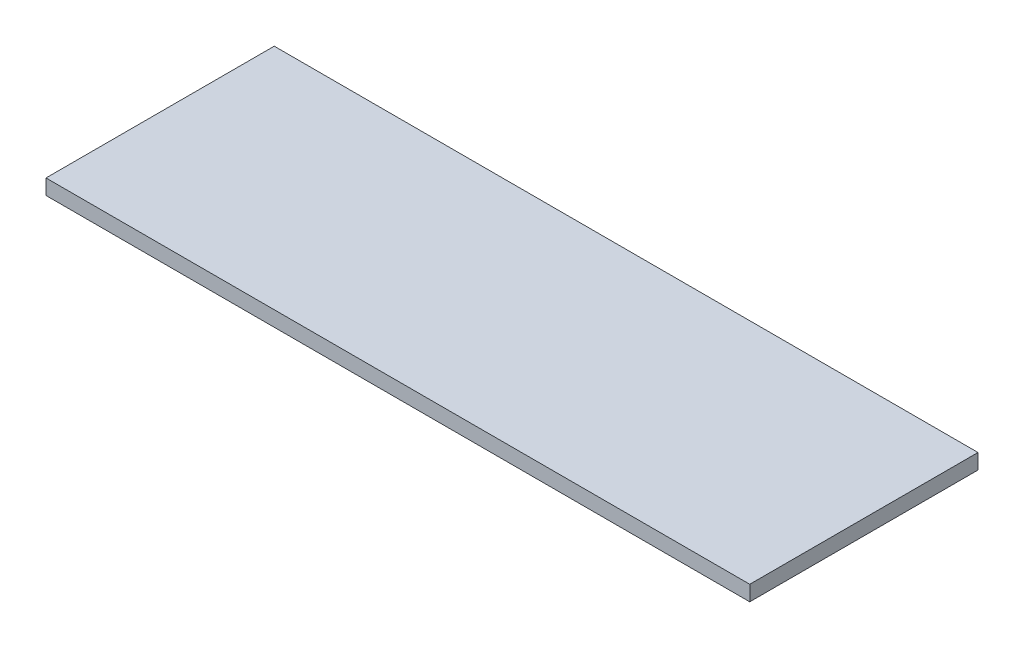
ISO-10303-21;
HEADER;
FILE_DESCRIPTION(('STEP AP214'),'2;1');
FILE_NAME('part.step','',(''),(''),'','','');
FILE_SCHEMA(('AUTOMOTIVE_DESIGN { 1 0 10303 214 1 1 1 1 }'));
ENDSEC;
DATA;
#1=APPLICATION_CONTEXT('core data for automotive mechanical design processes');
#2=APPLICATION_PROTOCOL_DEFINITION('international standard','automotive_design',2000,#1);
#3=PRODUCT_CONTEXT('',#1,'mechanical');
#4=PRODUCT('Part','Part','',(#3));
#5=PRODUCT_RELATED_PRODUCT_CATEGORY('part','',(#4));
#6=PRODUCT_DEFINITION_FORMATION('','',#4);
#7=PRODUCT_DEFINITION_CONTEXT('part definition',#1,'design');
#8=PRODUCT_DEFINITION('design','',#6,#7);
#9=PRODUCT_DEFINITION_SHAPE('','',#8);
#10=(LENGTH_UNIT() NAMED_UNIT(*) SI_UNIT(.MILLI.,.METRE.));
#11=(NAMED_UNIT(*) PLANE_ANGLE_UNIT() SI_UNIT($,.RADIAN.));
#12=(NAMED_UNIT(*) SI_UNIT($,.STERADIAN.) SOLID_ANGLE_UNIT());
#13=UNCERTAINTY_MEASURE_WITH_UNIT(LENGTH_MEASURE(1.E-05),#10,'distance_accuracy_value','');
#14=(GEOMETRIC_REPRESENTATION_CONTEXT(3) GLOBAL_UNCERTAINTY_ASSIGNED_CONTEXT((#13)) GLOBAL_UNIT_ASSIGNED_CONTEXT((#10,
#11,#12)) REPRESENTATION_CONTEXT('',''));
#15=CARTESIAN_POINT('',(0.,0.,0.));
#16=DIRECTION('',(0.,0.,1.));
#17=DIRECTION('',(1.,0.,0.));
#18=AXIS2_PLACEMENT_3D('',#15,#16,#17);
#19=CARTESIAN_POINT('',(0.,1.6,0.));
#20=DIRECTION('',(1.,0.,0.));
#21=DIRECTION('',(0.,0.,-1.));
#22=AXIS2_PLACEMENT_3D('',#19,#20,#21);
#23=PLANE('',#22);
#24=DIRECTION('',(0.,0.,1.));
#25=VECTOR('',#24,1.);
#26=CARTESIAN_POINT('',(0.,0.,0.));
#27=LINE('',#26,#25);
#28=CARTESIAN_POINT('',(0.,0.,-24.));
#29=VERTEX_POINT('',#28);
#30=CARTESIAN_POINT('',(0.,0.,0.));
#31=VERTEX_POINT('',#30);
#32=EDGE_CURVE('E96',#29,#31,#27,.T.);
#33=ORIENTED_EDGE('',*,*,#32,.T.);
#34=DIRECTION('',(0.,-1.,0.));
#35=VECTOR('',#34,1.);
#36=CARTESIAN_POINT('',(0.,1.6,0.));
#37=LINE('',#36,#35);
#38=CARTESIAN_POINT('',(0.,1.6,0.));
#39=VERTEX_POINT('',#38);
#40=EDGE_CURVE('E11',#39,#31,#37,.T.);
#41=ORIENTED_EDGE('',*,*,#40,.F.);
#42=DIRECTION('',(0.,0.,1.));
#43=VECTOR('',#42,1.);
#44=CARTESIAN_POINT('',(0.,1.6,0.));
#45=LINE('',#44,#43);
#46=CARTESIAN_POINT('',(0.,1.6,-24.));
#47=VERTEX_POINT('',#46);
#48=EDGE_CURVE('E84',#47,#39,#45,.T.);
#49=ORIENTED_EDGE('',*,*,#48,.F.);
#50=DIRECTION('',(0.,-1.,0.));
#51=VECTOR('',#50,1.);
#52=CARTESIAN_POINT('',(0.,1.6,-24.));
#53=LINE('',#52,#51);
#54=EDGE_CURVE('E92',#47,#29,#53,.T.);
#55=ORIENTED_EDGE('',*,*,#54,.T.);
#56=EDGE_LOOP('',(#33,#41,#49,#55));
#57=FACE_BOUND('',#56,.T.);
#58=ADVANCED_FACE('F33',(#57),#23,.F.);
#59=CARTESIAN_POINT('',(0.,1.6,0.));
#60=DIRECTION('',(0.,0.,-1.));
#61=DIRECTION('',(-1.,0.,0.));
#62=AXIS2_PLACEMENT_3D('',#59,#60,#61);
#63=PLANE('',#62);
#64=DIRECTION('',(1.,0.,0.));
#65=VECTOR('',#64,1.);
#66=CARTESIAN_POINT('',(0.,0.,0.));
#67=LINE('',#66,#65);
#68=CARTESIAN_POINT('',(74.,0.,0.));
#69=VERTEX_POINT('',#68);
#70=EDGE_CURVE('E88',#31,#69,#67,.T.);
#71=ORIENTED_EDGE('',*,*,#70,.T.);
#72=DIRECTION('',(0.,-1.,0.));
#73=VECTOR('',#72,1.);
#74=CARTESIAN_POINT('',(74.,1.6,0.));
#75=LINE('',#74,#73);
#76=CARTESIAN_POINT('',(74.,1.6,0.));
#77=VERTEX_POINT('',#76);
#78=EDGE_CURVE('E41',#77,#69,#75,.T.);
#79=ORIENTED_EDGE('',*,*,#78,.F.);
#80=DIRECTION('',(1.,0.,0.));
#81=VECTOR('',#80,1.);
#82=CARTESIAN_POINT('',(0.,1.6,0.));
#83=LINE('',#82,#81);
#84=EDGE_CURVE('E79',#39,#77,#83,.T.);
#85=ORIENTED_EDGE('',*,*,#84,.F.);
#86=ORIENTED_EDGE('',*,*,#40,.T.);
#87=EDGE_LOOP('',(#71,#79,#85,#86));
#88=FACE_BOUND('',#87,.T.);
#89=ADVANCED_FACE('F87',(#88),#63,.F.);
#90=CARTESIAN_POINT('',(74.,1.6,0.));
#91=DIRECTION('',(-1.,0.,0.));
#92=DIRECTION('',(0.,0.,1.));
#93=AXIS2_PLACEMENT_3D('',#90,#91,#92);
#94=PLANE('',#93);
#95=DIRECTION('',(0.,0.,-1.));
#96=VECTOR('',#95,1.);
#97=CARTESIAN_POINT('',(74.,0.,0.));
#98=LINE('',#97,#96);
#99=CARTESIAN_POINT('',(74.,0.,-24.));
#100=VERTEX_POINT('',#99);
#101=EDGE_CURVE('E66',#69,#100,#98,.T.);
#102=ORIENTED_EDGE('',*,*,#101,.T.);
#103=DIRECTION('',(0.,-1.,0.));
#104=VECTOR('',#103,1.);
#105=CARTESIAN_POINT('',(74.,1.6,-24.));
#106=LINE('',#105,#104);
#107=CARTESIAN_POINT('',(74.,1.6,-24.));
#108=VERTEX_POINT('',#107);
#109=EDGE_CURVE('E89',#108,#100,#106,.T.);
#110=ORIENTED_EDGE('',*,*,#109,.F.);
#111=DIRECTION('',(0.,0.,-1.));
#112=VECTOR('',#111,1.);
#113=CARTESIAN_POINT('',(74.,1.6,0.));
#114=LINE('',#113,#112);
#115=EDGE_CURVE('E82',#77,#108,#114,.T.);
#116=ORIENTED_EDGE('',*,*,#115,.F.);
#117=ORIENTED_EDGE('',*,*,#78,.T.);
#118=EDGE_LOOP('',(#102,#110,#116,#117));
#119=FACE_BOUND('',#118,.T.);
#120=ADVANCED_FACE('F90',(#119),#94,.F.);
#121=CARTESIAN_POINT('',(0.,1.6,-24.));
#122=DIRECTION('',(0.,0.,1.));
#123=DIRECTION('',(1.,0.,0.));
#124=AXIS2_PLACEMENT_3D('',#121,#122,#123);
#125=PLANE('',#124);
#126=DIRECTION('',(-1.,0.,0.));
#127=VECTOR('',#126,1.);
#128=CARTESIAN_POINT('',(0.,0.,-24.));
#129=LINE('',#128,#127);
#130=EDGE_CURVE('E72',#100,#29,#129,.T.);
#131=ORIENTED_EDGE('',*,*,#130,.T.);
#132=ORIENTED_EDGE('',*,*,#54,.F.);
#133=DIRECTION('',(-1.,0.,0.));
#134=VECTOR('',#133,1.);
#135=CARTESIAN_POINT('',(0.,1.6,-24.));
#136=LINE('',#135,#134);
#137=EDGE_CURVE('E49',#108,#47,#136,.T.);
#138=ORIENTED_EDGE('',*,*,#137,.F.);
#139=ORIENTED_EDGE('',*,*,#109,.T.);
#140=EDGE_LOOP('',(#131,#132,#138,#139));
#141=FACE_BOUND('',#140,.T.);
#142=ADVANCED_FACE('F103',(#141),#125,.F.);
#143=CARTESIAN_POINT('',(0.,1.6,0.));
#144=DIRECTION('',(0.,-1.,0.));
#145=DIRECTION('',(0.,0.,-1.));
#146=AXIS2_PLACEMENT_3D('',#143,#144,#145);
#147=PLANE('',#146);
#148=ORIENTED_EDGE('',*,*,#48,.T.);
#149=ORIENTED_EDGE('',*,*,#84,.T.);
#150=ORIENTED_EDGE('',*,*,#115,.T.);
#151=ORIENTED_EDGE('',*,*,#137,.T.);
#152=EDGE_LOOP('',(#148,#149,#150,#151));
#153=FACE_BOUND('',#152,.T.);
#154=ADVANCED_FACE('F80',(#153),#147,.F.);
#155=CARTESIAN_POINT('',(0.,0.,0.));
#156=DIRECTION('',(0.,-1.,0.));
#157=DIRECTION('',(0.,0.,-1.));
#158=AXIS2_PLACEMENT_3D('',#155,#156,#157);
#159=PLANE('',#158);
#160=ORIENTED_EDGE('',*,*,#32,.F.);
#161=ORIENTED_EDGE('',*,*,#130,.F.);
#162=ORIENTED_EDGE('',*,*,#101,.F.);
#163=ORIENTED_EDGE('',*,*,#70,.F.);
#164=EDGE_LOOP('',(#160,#161,#162,#163));
#165=FACE_BOUND('',#164,.T.);
#166=ADVANCED_FACE('F106',(#165),#159,.T.);
#167=CLOSED_SHELL('',(#58,#89,#120,#142,#154,#166));
#168=MANIFOLD_SOLID_BREP('B2',#167);
#169=ADVANCED_BREP_SHAPE_REPRESENTATION('',(#18,#168),#14);
#170=SHAPE_DEFINITION_REPRESENTATION(#9,#169);
ENDSEC;
END-ISO-10303-21;
